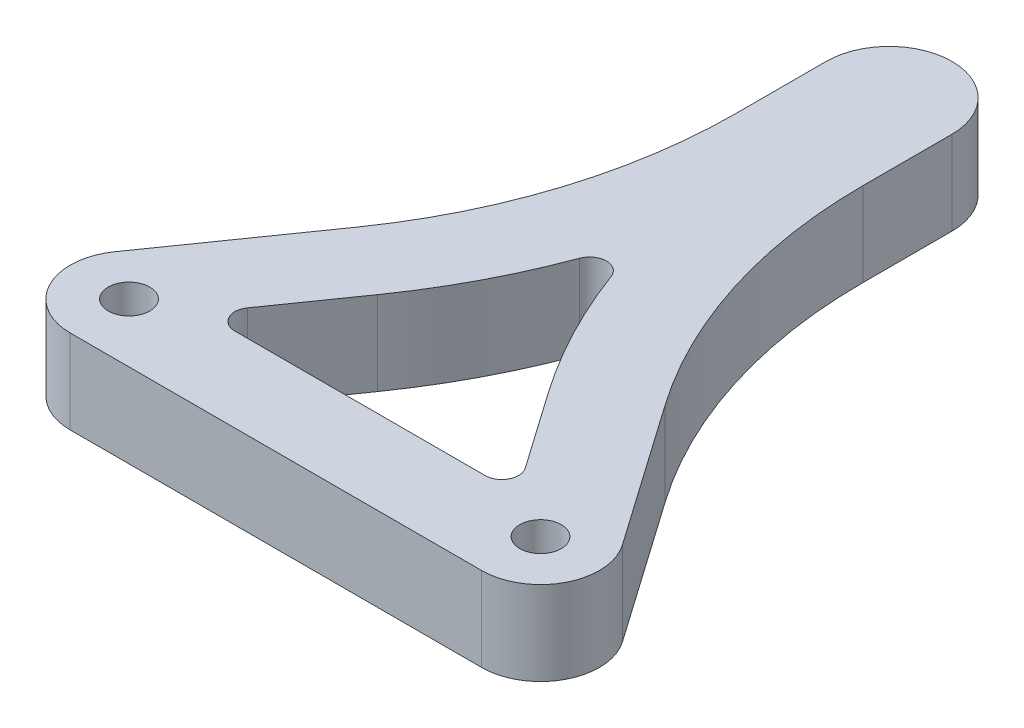
ISO-10303-21;
HEADER;
FILE_DESCRIPTION(('STEP AP214'),'2;1');
FILE_NAME('part.step','',(''),(''),'','','');
FILE_SCHEMA(('AUTOMOTIVE_DESIGN { 1 0 10303 214 1 1 1 1 }'));
ENDSEC;
DATA;
#1=APPLICATION_CONTEXT('core data for automotive mechanical design processes');
#2=APPLICATION_PROTOCOL_DEFINITION('international standard','automotive_design',2000,#1);
#3=PRODUCT_CONTEXT('',#1,'mechanical');
#4=PRODUCT('Part','Part','',(#3));
#5=PRODUCT_RELATED_PRODUCT_CATEGORY('part','',(#4));
#6=PRODUCT_DEFINITION_FORMATION('','',#4);
#7=PRODUCT_DEFINITION_CONTEXT('part definition',#1,'design');
#8=PRODUCT_DEFINITION('design','',#6,#7);
#9=PRODUCT_DEFINITION_SHAPE('','',#8);
#10=(LENGTH_UNIT() NAMED_UNIT(*) SI_UNIT(.MILLI.,.METRE.));
#11=(NAMED_UNIT(*) PLANE_ANGLE_UNIT() SI_UNIT($,.RADIAN.));
#12=(NAMED_UNIT(*) SI_UNIT($,.STERADIAN.) SOLID_ANGLE_UNIT());
#13=UNCERTAINTY_MEASURE_WITH_UNIT(LENGTH_MEASURE(1.E-05),#10,'distance_accuracy_value','');
#14=(GEOMETRIC_REPRESENTATION_CONTEXT(3) GLOBAL_UNCERTAINTY_ASSIGNED_CONTEXT((#13)) GLOBAL_UNIT_ASSIGNED_CONTEXT((#10,
#11,#12)) REPRESENTATION_CONTEXT('',''));
#15=CARTESIAN_POINT('',(0.,0.,0.));
#16=DIRECTION('',(0.,0.,1.));
#17=DIRECTION('',(1.,0.,0.));
#18=AXIS2_PLACEMENT_3D('',#15,#16,#17);
#19=CARTESIAN_POINT('',(0.,10.,-66.));
#20=DIRECTION('',(0.,1.,0.));
#21=DIRECTION('',(0.,0.,1.));
#22=AXIS2_PLACEMENT_3D('',#19,#20,#21);
#23=PLANE('',#22);
#24=CARTESIAN_POINT('',(-24.5,10.,0.));
#25=DIRECTION('',(0.,1.,0.));
#26=DIRECTION('',(0.,0.,1.));
#27=AXIS2_PLACEMENT_3D('',#24,#25,#26);
#28=CIRCLE('',#27,2.475);
#29=CARTESIAN_POINT('',(-24.5,10.,2.475));
#30=VERTEX_POINT('',#29);
#31=EDGE_CURVE('E207',#30,#30,#28,.T.);
#32=ORIENTED_EDGE('',*,*,#31,.F.);
#33=EDGE_LOOP('',(#32));
#34=FACE_BOUND('',#33,.T.);
#35=CARTESIAN_POINT('',(0.,10.,-66.));
#36=DIRECTION('',(0.,1.,0.));
#37=DIRECTION('',(0.,0.,1.));
#38=AXIS2_PLACEMENT_3D('',#35,#36,#37);
#39=CIRCLE('',#38,7.5);
#40=CARTESIAN_POINT('',(7.5,10.,-66.));
#41=VERTEX_POINT('',#40);
#42=CARTESIAN_POINT('',(-7.5,10.,-66.));
#43=VERTEX_POINT('',#42);
#44=EDGE_CURVE('E213',#41,#43,#39,.T.);
#45=ORIENTED_EDGE('',*,*,#44,.T.);
#46=DIRECTION('',(0.,0.,1.));
#47=VECTOR('',#46,1.);
#48=CARTESIAN_POINT('',(-7.5,10.,-66.));
#49=LINE('',#48,#47);
#50=CARTESIAN_POINT('',(-7.50000000000001,10.,-55.4005710167026));
#51=VERTEX_POINT('',#50);
#52=EDGE_CURVE('E216',#43,#51,#49,.T.);
#53=ORIENTED_EDGE('',*,*,#52,.T.);
#54=CARTESIAN_POINT('',(-67.5,10.,-55.4005710167026));
#55=DIRECTION('',(0.,-1.,0.));
#56=DIRECTION('',(0.,0.,1.));
#57=AXIS2_PLACEMENT_3D('',#54,#55,#56);
#58=CIRCLE('',#57,60.);
#59=CARTESIAN_POINT('',(-18.3508773426605,10.,-20.9859848356397));
#60=VERTEX_POINT('',#59);
#61=EDGE_CURVE('E219',#51,#60,#58,.T.);
#62=ORIENTED_EDGE('',*,*,#61,.T.);
#63=DIRECTION('',(-0.573576436351047,0.,0.819152044288991));
#64=VECTOR('',#63,1.);
#65=CARTESIAN_POINT('',(-18.3508773426606,10.,-20.9859848356397));
#66=LINE('',#65,#64);
#67=CARTESIAN_POINT('',(-30.2340643100229,10.,-4.01503505445733));
#68=VERTEX_POINT('',#67);
#69=EDGE_CURVE('E221',#60,#68,#66,.T.);
#70=ORIENTED_EDGE('',*,*,#69,.T.);
#71=CARTESIAN_POINT('',(-24.5,10.,0.));
#72=DIRECTION('',(0.,1.,0.));
#73=DIRECTION('',(0.,0.,1.));
#74=AXIS2_PLACEMENT_3D('',#71,#72,#73);
#75=CIRCLE('',#74,7.);
#76=CARTESIAN_POINT('',(-24.5,10.,7.));
#77=VERTEX_POINT('',#76);
#78=EDGE_CURVE('E223',#68,#77,#75,.T.);
#79=ORIENTED_EDGE('',*,*,#78,.T.);
#80=DIRECTION('',(1.,0.,0.));
#81=VECTOR('',#80,1.);
#82=CARTESIAN_POINT('',(-24.5,10.,7.));
#83=LINE('',#82,#81);
#84=CARTESIAN_POINT('',(24.5,10.,7.));
#85=VERTEX_POINT('',#84);
#86=EDGE_CURVE('E225',#77,#85,#83,.T.);
#87=ORIENTED_EDGE('',*,*,#86,.T.);
#88=CARTESIAN_POINT('',(24.5,10.,0.));
#89=DIRECTION('',(0.,1.,0.));
#90=DIRECTION('',(0.,0.,1.));
#91=AXIS2_PLACEMENT_3D('',#88,#89,#90);
#92=CIRCLE('',#91,7.);
#93=CARTESIAN_POINT('',(30.2340643100229,10.,-4.01503505445733));
#94=VERTEX_POINT('',#93);
#95=EDGE_CURVE('E227',#85,#94,#92,.T.);
#96=ORIENTED_EDGE('',*,*,#95,.T.);
#97=DIRECTION('',(-0.573576436351047,0.,-0.819152044288991));
#98=VECTOR('',#97,1.);
#99=CARTESIAN_POINT('',(18.3508773426606,10.,-20.9859848356397));
#100=LINE('',#99,#98);
#101=CARTESIAN_POINT('',(18.3508773426606,10.,-20.9859848356397));
#102=VERTEX_POINT('',#101);
#103=EDGE_CURVE('E229',#94,#102,#100,.T.);
#104=ORIENTED_EDGE('',*,*,#103,.T.);
#105=CARTESIAN_POINT('',(67.5,10.,-55.4005710167026));
#106=DIRECTION('',(0.,-1.,0.));
#107=DIRECTION('',(0.,0.,-1.));
#108=AXIS2_PLACEMENT_3D('',#105,#106,#107);
#109=CIRCLE('',#108,60.);
#110=CARTESIAN_POINT('',(7.50000000000001,10.,-55.4005710167025));
#111=VERTEX_POINT('',#110);
#112=EDGE_CURVE('E231',#102,#111,#109,.T.);
#113=ORIENTED_EDGE('',*,*,#112,.T.);
#114=DIRECTION('',(0.,0.,-1.));
#115=VECTOR('',#114,1.);
#116=CARTESIAN_POINT('',(7.5,10.,-66.));
#117=LINE('',#116,#115);
#118=EDGE_CURVE('E233',#111,#41,#117,.T.);
#119=ORIENTED_EDGE('',*,*,#118,.T.);
#120=EDGE_LOOP('',(#45,#53,#62,#70,#79,#87,#96,#104,#113,#119));
#121=FACE_BOUND('',#120,.T.);
#122=CARTESIAN_POINT('',(24.5,10.,0.));
#123=DIRECTION('',(0.,1.,0.));
#124=DIRECTION('',(0.,0.,1.));
#125=AXIS2_PLACEMENT_3D('',#122,#123,#124);
#126=CIRCLE('',#125,2.475);
#127=CARTESIAN_POINT('',(24.5,10.,2.475));
#128=VERTEX_POINT('',#127);
#129=EDGE_CURVE('E201',#128,#128,#126,.T.);
#130=ORIENTED_EDGE('',*,*,#129,.F.);
#131=EDGE_LOOP('',(#130));
#132=FACE_BOUND('',#131,.T.);
#133=DIRECTION('',(-0.573576436351047,0.,0.819152044288991));
#134=VECTOR('',#133,1.);
#135=CARTESIAN_POINT('',(-10.1593568997706,10.,-15.2502204721293));
#136=LINE('',#135,#134);
#137=CARTESIAN_POINT('',(-10.1593568997706,10.,-15.2502204721293));
#138=VERTEX_POINT('',#137);
#139=CARTESIAN_POINT('',(-16.5333934537221,10.,-6.1471528727021));
#140=VERTEX_POINT('',#139);
#141=EDGE_CURVE('E168',#138,#140,#136,.T.);
#142=ORIENTED_EDGE('',*,*,#141,.F.);
#143=CARTESIAN_POINT('',(-67.5,10.,-55.4005710167026));
#144=DIRECTION('',(0.,-1.,0.));
#145=DIRECTION('',(0.,0.,1.));
#146=AXIS2_PLACEMENT_3D('',#143,#144,#145);
#147=CIRCLE('',#146,70.);
#148=CARTESIAN_POINT('',(-1.875,10.,-31.0416019293212));
#149=VERTEX_POINT('',#148);
#150=EDGE_CURVE('E160',#149,#138,#147,.T.);
#151=ORIENTED_EDGE('',*,*,#150,.F.);
#152=CARTESIAN_POINT('',(0.,10.,-30.3456313839675));
#153=DIRECTION('',(0.,1.,0.));
#154=DIRECTION('',(0.,0.,1.));
#155=AXIS2_PLACEMENT_3D('',#152,#153,#154);
#156=CIRCLE('',#155,2.);
#157=CARTESIAN_POINT('',(1.875,10.,-31.0416019293212));
#158=VERTEX_POINT('',#157);
#159=EDGE_CURVE('E299',#149,#158,#156,.F.);
#160=ORIENTED_EDGE('',*,*,#159,.T.);
#161=CARTESIAN_POINT('',(67.5,10.,-55.4005710167026));
#162=DIRECTION('',(0.,-1.,0.));
#163=DIRECTION('',(0.,0.,-1.));
#164=AXIS2_PLACEMENT_3D('',#161,#162,#163);
#165=CIRCLE('',#164,70.);
#166=CARTESIAN_POINT('',(10.1593568997706,10.,-15.2502204721293));
#167=VERTEX_POINT('',#166);
#168=EDGE_CURVE('E186',#167,#158,#165,.T.);
#169=ORIENTED_EDGE('',*,*,#168,.F.);
#170=DIRECTION('',(-0.573576436351047,0.,-0.819152044288991));
#171=VECTOR('',#170,1.);
#172=CARTESIAN_POINT('',(10.1593568997706,10.,-15.2502204721293));
#173=LINE('',#172,#171);
#174=CARTESIAN_POINT('',(16.5333934537221,10.,-6.14715287270209));
#175=VERTEX_POINT('',#174);
#176=EDGE_CURVE('E182',#175,#167,#173,.T.);
#177=ORIENTED_EDGE('',*,*,#176,.F.);
#178=CARTESIAN_POINT('',(14.8950893651441,10.,-5.));
#179=DIRECTION('',(0.,1.,0.));
#180=DIRECTION('',(0.,0.,1.));
#181=AXIS2_PLACEMENT_3D('',#178,#179,#180);
#182=CIRCLE('',#181,2.);
#183=CARTESIAN_POINT('',(14.8950893651441,10.,-3.));
#184=VERTEX_POINT('',#183);
#185=EDGE_CURVE('E303',#175,#184,#182,.F.);
#186=ORIENTED_EDGE('',*,*,#185,.T.);
#187=DIRECTION('',(1.,0.,0.));
#188=VECTOR('',#187,1.);
#189=CARTESIAN_POINT('',(-18.7370536190865,10.,-3.));
#190=LINE('',#189,#188);
#191=CARTESIAN_POINT('',(-14.8950893651442,10.,-3.));
#192=VERTEX_POINT('',#191);
#193=EDGE_CURVE('E179',#192,#184,#190,.T.);
#194=ORIENTED_EDGE('',*,*,#193,.F.);
#195=CARTESIAN_POINT('',(-14.8950893651442,10.,-5.));
#196=DIRECTION('',(0.,1.,0.));
#197=DIRECTION('',(0.,0.,1.));
#198=AXIS2_PLACEMENT_3D('',#195,#196,#197);
#199=CIRCLE('',#198,2.);
#200=EDGE_CURVE('E11',#192,#140,#199,.F.);
#201=ORIENTED_EDGE('',*,*,#200,.T.);
#202=EDGE_LOOP('',(#142,#151,#160,#169,#177,#186,#194,#201));
#203=FACE_BOUND('',#202,.T.);
#204=ADVANCED_FACE('F35',(#34,#121,#132,#203),#23,.T.);
#205=CARTESIAN_POINT('',(0.,0.,-66.));
#206=DIRECTION('',(0.,1.,0.));
#207=DIRECTION('',(0.,0.,1.));
#208=AXIS2_PLACEMENT_3D('',#205,#206,#207);
#209=PLANE('',#208);
#210=CARTESIAN_POINT('',(24.5,0.,0.));
#211=DIRECTION('',(0.,1.,0.));
#212=DIRECTION('',(0.,0.,1.));
#213=AXIS2_PLACEMENT_3D('',#210,#211,#212);
#214=CIRCLE('',#213,2.475);
#215=CARTESIAN_POINT('',(24.5,0.,2.475));
#216=VERTEX_POINT('',#215);
#217=EDGE_CURVE('E176',#216,#216,#214,.T.);
#218=ORIENTED_EDGE('',*,*,#217,.T.);
#219=EDGE_LOOP('',(#218));
#220=FACE_BOUND('',#219,.T.);
#221=CARTESIAN_POINT('',(-24.5,0.,0.));
#222=DIRECTION('',(0.,1.,0.));
#223=DIRECTION('',(0.,0.,1.));
#224=AXIS2_PLACEMENT_3D('',#221,#222,#223);
#225=CIRCLE('',#224,2.475);
#226=CARTESIAN_POINT('',(-24.5,0.,2.475));
#227=VERTEX_POINT('',#226);
#228=EDGE_CURVE('E204',#227,#227,#225,.T.);
#229=ORIENTED_EDGE('',*,*,#228,.T.);
#230=EDGE_LOOP('',(#229));
#231=FACE_BOUND('',#230,.T.);
#232=CARTESIAN_POINT('',(0.,0.,-66.));
#233=DIRECTION('',(0.,1.,0.));
#234=DIRECTION('',(0.,0.,1.));
#235=AXIS2_PLACEMENT_3D('',#232,#233,#234);
#236=CIRCLE('',#235,7.5);
#237=CARTESIAN_POINT('',(7.5,0.,-66.));
#238=VERTEX_POINT('',#237);
#239=CARTESIAN_POINT('',(-7.5,0.,-66.));
#240=VERTEX_POINT('',#239);
#241=EDGE_CURVE('E210',#238,#240,#236,.T.);
#242=ORIENTED_EDGE('',*,*,#241,.F.);
#243=DIRECTION('',(0.,0.,-1.));
#244=VECTOR('',#243,1.);
#245=CARTESIAN_POINT('',(7.5,0.,-66.));
#246=LINE('',#245,#244);
#247=CARTESIAN_POINT('',(7.50000000000001,0.,-55.4005710167025));
#248=VERTEX_POINT('',#247);
#249=EDGE_CURVE('E217',#248,#238,#246,.T.);
#250=ORIENTED_EDGE('',*,*,#249,.F.);
#251=CARTESIAN_POINT('',(67.5,0.,-55.4005710167026));
#252=DIRECTION('',(0.,-1.,0.));
#253=DIRECTION('',(0.,0.,-1.));
#254=AXIS2_PLACEMENT_3D('',#251,#252,#253);
#255=CIRCLE('',#254,60.);
#256=CARTESIAN_POINT('',(18.3508773426606,0.,-20.9859848356397));
#257=VERTEX_POINT('',#256);
#258=EDGE_CURVE('E252',#257,#248,#255,.T.);
#259=ORIENTED_EDGE('',*,*,#258,.F.);
#260=DIRECTION('',(-0.573576436351047,0.,-0.819152044288991));
#261=VECTOR('',#260,1.);
#262=CARTESIAN_POINT('',(18.3508773426606,0.,-20.9859848356397));
#263=LINE('',#262,#261);
#264=CARTESIAN_POINT('',(30.2340643100229,0.,-4.01503505445733));
#265=VERTEX_POINT('',#264);
#266=EDGE_CURVE('E250',#265,#257,#263,.T.);
#267=ORIENTED_EDGE('',*,*,#266,.F.);
#268=CARTESIAN_POINT('',(24.5,0.,0.));
#269=DIRECTION('',(0.,1.,0.));
#270=DIRECTION('',(0.,0.,1.));
#271=AXIS2_PLACEMENT_3D('',#268,#269,#270);
#272=CIRCLE('',#271,7.);
#273=CARTESIAN_POINT('',(24.5,0.,7.));
#274=VERTEX_POINT('',#273);
#275=EDGE_CURVE('E248',#274,#265,#272,.T.);
#276=ORIENTED_EDGE('',*,*,#275,.F.);
#277=DIRECTION('',(1.,0.,0.));
#278=VECTOR('',#277,1.);
#279=CARTESIAN_POINT('',(-24.5,0.,7.));
#280=LINE('',#279,#278);
#281=CARTESIAN_POINT('',(-24.5,0.,7.));
#282=VERTEX_POINT('',#281);
#283=EDGE_CURVE('E246',#282,#274,#280,.T.);
#284=ORIENTED_EDGE('',*,*,#283,.F.);
#285=CARTESIAN_POINT('',(-24.5,0.,0.));
#286=DIRECTION('',(0.,1.,0.));
#287=DIRECTION('',(0.,0.,1.));
#288=AXIS2_PLACEMENT_3D('',#285,#286,#287);
#289=CIRCLE('',#288,7.);
#290=CARTESIAN_POINT('',(-30.2340643100229,0.,-4.01503505445733));
#291=VERTEX_POINT('',#290);
#292=EDGE_CURVE('E244',#291,#282,#289,.T.);
#293=ORIENTED_EDGE('',*,*,#292,.F.);
#294=DIRECTION('',(-0.573576436351047,0.,0.819152044288991));
#295=VECTOR('',#294,1.);
#296=CARTESIAN_POINT('',(-18.3508773426606,0.,-20.9859848356397));
#297=LINE('',#296,#295);
#298=CARTESIAN_POINT('',(-18.3508773426605,0.,-20.9859848356397));
#299=VERTEX_POINT('',#298);
#300=EDGE_CURVE('E242',#299,#291,#297,.T.);
#301=ORIENTED_EDGE('',*,*,#300,.F.);
#302=CARTESIAN_POINT('',(-67.5,0.,-55.4005710167026));
#303=DIRECTION('',(0.,-1.,0.));
#304=DIRECTION('',(0.,0.,1.));
#305=AXIS2_PLACEMENT_3D('',#302,#303,#304);
#306=CIRCLE('',#305,60.);
#307=CARTESIAN_POINT('',(-7.50000000000001,0.,-55.4005710167026));
#308=VERTEX_POINT('',#307);
#309=EDGE_CURVE('E240',#308,#299,#306,.T.);
#310=ORIENTED_EDGE('',*,*,#309,.F.);
#311=DIRECTION('',(0.,0.,1.));
#312=VECTOR('',#311,1.);
#313=CARTESIAN_POINT('',(-7.5,0.,-66.));
#314=LINE('',#313,#312);
#315=EDGE_CURVE('E238',#240,#308,#314,.T.);
#316=ORIENTED_EDGE('',*,*,#315,.F.);
#317=EDGE_LOOP('',(#242,#250,#259,#267,#276,#284,#293,#301,#310,#316));
#318=FACE_BOUND('',#317,.T.);
#319=CARTESIAN_POINT('',(67.5,0.,-55.4005710167026));
#320=DIRECTION('',(0.,-1.,0.));
#321=DIRECTION('',(0.,0.,-1.));
#322=AXIS2_PLACEMENT_3D('',#319,#320,#321);
#323=CIRCLE('',#322,70.);
#324=CARTESIAN_POINT('',(10.1593568997706,0.,-15.2502204721293));
#325=VERTEX_POINT('',#324);
#326=CARTESIAN_POINT('',(1.875,0.,-31.0416019293212));
#327=VERTEX_POINT('',#326);
#328=EDGE_CURVE('E169',#325,#327,#323,.T.);
#329=ORIENTED_EDGE('',*,*,#328,.T.);
#330=CARTESIAN_POINT('',(0.,0.,-30.3456313839675));
#331=DIRECTION('',(0.,1.,0.));
#332=DIRECTION('',(0.,0.,1.));
#333=AXIS2_PLACEMENT_3D('',#330,#331,#332);
#334=CIRCLE('',#333,2.);
#335=CARTESIAN_POINT('',(-1.875,0.,-31.0416019293212));
#336=VERTEX_POINT('',#335);
#337=EDGE_CURVE('E297',#327,#336,#334,.T.);
#338=ORIENTED_EDGE('',*,*,#337,.T.);
#339=CARTESIAN_POINT('',(-67.5,0.,-55.4005710167026));
#340=DIRECTION('',(0.,-1.,0.));
#341=DIRECTION('',(0.,0.,1.));
#342=AXIS2_PLACEMENT_3D('',#339,#340,#341);
#343=CIRCLE('',#342,70.);
#344=CARTESIAN_POINT('',(-10.1593568997706,0.,-15.2502204721293));
#345=VERTEX_POINT('',#344);
#346=EDGE_CURVE('E189',#336,#345,#343,.T.);
#347=ORIENTED_EDGE('',*,*,#346,.T.);
#348=DIRECTION('',(-0.573576436351047,0.,0.819152044288991));
#349=VECTOR('',#348,1.);
#350=CARTESIAN_POINT('',(-10.1593568997706,0.,-15.2502204721293));
#351=LINE('',#350,#349);
#352=CARTESIAN_POINT('',(-16.5333934537221,0.,-6.1471528727021));
#353=VERTEX_POINT('',#352);
#354=EDGE_CURVE('E175',#345,#353,#351,.T.);
#355=ORIENTED_EDGE('',*,*,#354,.T.);
#356=CARTESIAN_POINT('',(-14.8950893651442,0.,-5.));
#357=DIRECTION('',(0.,1.,0.));
#358=DIRECTION('',(0.,0.,1.));
#359=AXIS2_PLACEMENT_3D('',#356,#357,#358);
#360=CIRCLE('',#359,2.);
#361=CARTESIAN_POINT('',(-14.8950893651442,0.,-3.));
#362=VERTEX_POINT('',#361);
#363=EDGE_CURVE('E43',#353,#362,#360,.T.);
#364=ORIENTED_EDGE('',*,*,#363,.T.);
#365=DIRECTION('',(1.,0.,0.));
#366=VECTOR('',#365,1.);
#367=CARTESIAN_POINT('',(-18.7370536190865,0.,-3.));
#368=LINE('',#367,#366);
#369=CARTESIAN_POINT('',(14.8950893651441,0.,-3.));
#370=VERTEX_POINT('',#369);
#371=EDGE_CURVE('E192',#362,#370,#368,.T.);
#372=ORIENTED_EDGE('',*,*,#371,.T.);
#373=CARTESIAN_POINT('',(14.8950893651441,0.,-5.));
#374=DIRECTION('',(0.,1.,0.));
#375=DIRECTION('',(0.,0.,1.));
#376=AXIS2_PLACEMENT_3D('',#373,#374,#375);
#377=CIRCLE('',#376,2.);
#378=CARTESIAN_POINT('',(16.5333934537221,0.,-6.14715287270209));
#379=VERTEX_POINT('',#378);
#380=EDGE_CURVE('E301',#370,#379,#377,.T.);
#381=ORIENTED_EDGE('',*,*,#380,.T.);
#382=DIRECTION('',(-0.573576436351047,0.,-0.819152044288991));
#383=VECTOR('',#382,1.);
#384=CARTESIAN_POINT('',(10.1593568997706,0.,-15.2502204721293));
#385=LINE('',#384,#383);
#386=EDGE_CURVE('E195',#379,#325,#385,.T.);
#387=ORIENTED_EDGE('',*,*,#386,.T.);
#388=EDGE_LOOP('',(#329,#338,#347,#355,#364,#372,#381,#387));
#389=FACE_BOUND('',#388,.T.);
#390=ADVANCED_FACE('F306',(#220,#231,#318,#389),#209,.F.);
#391=CARTESIAN_POINT('',(0.,10.,-66.));
#392=DIRECTION('',(0.,-1.,0.));
#393=DIRECTION('',(0.,0.,-1.));
#394=AXIS2_PLACEMENT_3D('',#391,#392,#393);
#395=CYLINDRICAL_SURFACE('',#394,7.5);
#396=ORIENTED_EDGE('',*,*,#241,.T.);
#397=DIRECTION('',(0.,-1.,0.));
#398=VECTOR('',#397,1.);
#399=CARTESIAN_POINT('',(-7.5,10.,-66.));
#400=LINE('',#399,#398);
#401=EDGE_CURVE('E281',#43,#240,#400,.T.);
#402=ORIENTED_EDGE('',*,*,#401,.F.);
#403=ORIENTED_EDGE('',*,*,#44,.F.);
#404=DIRECTION('',(0.,-1.,0.));
#405=VECTOR('',#404,1.);
#406=CARTESIAN_POINT('',(7.5,10.,-66.));
#407=LINE('',#406,#405);
#408=EDGE_CURVE('E235',#41,#238,#407,.T.);
#409=ORIENTED_EDGE('',*,*,#408,.T.);
#410=EDGE_LOOP('',(#396,#402,#403,#409));
#411=FACE_BOUND('',#410,.T.);
#412=ADVANCED_FACE('F323',(#411),#395,.T.);
#413=CARTESIAN_POINT('',(-7.5,10.,-66.));
#414=DIRECTION('',(1.,0.,0.));
#415=DIRECTION('',(0.,0.,-1.));
#416=AXIS2_PLACEMENT_3D('',#413,#414,#415);
#417=PLANE('',#416);
#418=ORIENTED_EDGE('',*,*,#315,.T.);
#419=DIRECTION('',(0.,-1.,0.));
#420=VECTOR('',#419,1.);
#421=CARTESIAN_POINT('',(-7.50000000000001,10.,-55.4005710167026));
#422=LINE('',#421,#420);
#423=EDGE_CURVE('E278',#51,#308,#422,.T.);
#424=ORIENTED_EDGE('',*,*,#423,.F.);
#425=ORIENTED_EDGE('',*,*,#52,.F.);
#426=ORIENTED_EDGE('',*,*,#401,.T.);
#427=EDGE_LOOP('',(#418,#424,#425,#426));
#428=FACE_BOUND('',#427,.T.);
#429=ADVANCED_FACE('F363',(#428),#417,.F.);
#430=CARTESIAN_POINT('',(-67.5,10.,-55.4005710167026));
#431=DIRECTION('',(0.,-1.,0.));
#432=DIRECTION('',(0.,0.,-1.));
#433=AXIS2_PLACEMENT_3D('',#430,#431,#432);
#434=CYLINDRICAL_SURFACE('',#433,60.);
#435=ORIENTED_EDGE('',*,*,#309,.T.);
#436=DIRECTION('',(0.,-1.,0.));
#437=VECTOR('',#436,1.);
#438=CARTESIAN_POINT('',(-18.3508773426605,10.,-20.9859848356397));
#439=LINE('',#438,#437);
#440=EDGE_CURVE('E275',#60,#299,#439,.T.);
#441=ORIENTED_EDGE('',*,*,#440,.F.);
#442=ORIENTED_EDGE('',*,*,#61,.F.);
#443=ORIENTED_EDGE('',*,*,#423,.T.);
#444=EDGE_LOOP('',(#435,#441,#442,#443));
#445=FACE_BOUND('',#444,.T.);
#446=ADVANCED_FACE('F359',(#445),#434,.F.);
#447=CARTESIAN_POINT('',(-18.3508773426606,10.,-20.9859848356397));
#448=DIRECTION('',(0.819152044288991,0.,0.573576436351047));
#449=DIRECTION('',(0.573576436351047,0.,-0.819152044288991));
#450=AXIS2_PLACEMENT_3D('',#447,#448,#449);
#451=PLANE('',#450);
#452=ORIENTED_EDGE('',*,*,#300,.T.);
#453=DIRECTION('',(0.,-1.,0.));
#454=VECTOR('',#453,1.);
#455=CARTESIAN_POINT('',(-30.2340643100229,10.,-4.01503505445733));
#456=LINE('',#455,#454);
#457=EDGE_CURVE('E272',#68,#291,#456,.T.);
#458=ORIENTED_EDGE('',*,*,#457,.F.);
#459=ORIENTED_EDGE('',*,*,#69,.F.);
#460=ORIENTED_EDGE('',*,*,#440,.T.);
#461=EDGE_LOOP('',(#452,#458,#459,#460));
#462=FACE_BOUND('',#461,.T.);
#463=ADVANCED_FACE('F355',(#462),#451,.F.);
#464=CARTESIAN_POINT('',(-24.5,10.,0.));
#465=DIRECTION('',(0.,-1.,0.));
#466=DIRECTION('',(0.,0.,-1.));
#467=AXIS2_PLACEMENT_3D('',#464,#465,#466);
#468=CYLINDRICAL_SURFACE('',#467,7.);
#469=ORIENTED_EDGE('',*,*,#292,.T.);
#470=DIRECTION('',(0.,-1.,0.));
#471=VECTOR('',#470,1.);
#472=CARTESIAN_POINT('',(-24.5,10.,7.));
#473=LINE('',#472,#471);
#474=EDGE_CURVE('E269',#77,#282,#473,.T.);
#475=ORIENTED_EDGE('',*,*,#474,.F.);
#476=ORIENTED_EDGE('',*,*,#78,.F.);
#477=ORIENTED_EDGE('',*,*,#457,.T.);
#478=EDGE_LOOP('',(#469,#475,#476,#477));
#479=FACE_BOUND('',#478,.T.);
#480=ADVANCED_FACE('F351',(#479),#468,.T.);
#481=CARTESIAN_POINT('',(-24.5,10.,7.));
#482=DIRECTION('',(0.,0.,-1.));
#483=DIRECTION('',(-1.,0.,0.));
#484=AXIS2_PLACEMENT_3D('',#481,#482,#483);
#485=PLANE('',#484);
#486=ORIENTED_EDGE('',*,*,#283,.T.);
#487=DIRECTION('',(0.,-1.,0.));
#488=VECTOR('',#487,1.);
#489=CARTESIAN_POINT('',(24.5,10.,7.));
#490=LINE('',#489,#488);
#491=EDGE_CURVE('E266',#85,#274,#490,.T.);
#492=ORIENTED_EDGE('',*,*,#491,.F.);
#493=ORIENTED_EDGE('',*,*,#86,.F.);
#494=ORIENTED_EDGE('',*,*,#474,.T.);
#495=EDGE_LOOP('',(#486,#492,#493,#494));
#496=FACE_BOUND('',#495,.T.);
#497=ADVANCED_FACE('F347',(#496),#485,.F.);
#498=CARTESIAN_POINT('',(24.5,10.,0.));
#499=DIRECTION('',(0.,-1.,0.));
#500=DIRECTION('',(0.,0.,-1.));
#501=AXIS2_PLACEMENT_3D('',#498,#499,#500);
#502=CYLINDRICAL_SURFACE('',#501,7.);
#503=ORIENTED_EDGE('',*,*,#275,.T.);
#504=DIRECTION('',(0.,-1.,0.));
#505=VECTOR('',#504,1.);
#506=CARTESIAN_POINT('',(30.2340643100229,10.,-4.01503505445733));
#507=LINE('',#506,#505);
#508=EDGE_CURVE('E263',#94,#265,#507,.T.);
#509=ORIENTED_EDGE('',*,*,#508,.F.);
#510=ORIENTED_EDGE('',*,*,#95,.F.);
#511=ORIENTED_EDGE('',*,*,#491,.T.);
#512=EDGE_LOOP('',(#503,#509,#510,#511));
#513=FACE_BOUND('',#512,.T.);
#514=ADVANCED_FACE('F343',(#513),#502,.T.);
#515=CARTESIAN_POINT('',(18.3508773426606,10.,-20.9859848356397));
#516=DIRECTION('',(-0.819152044288991,0.,0.573576436351047));
#517=DIRECTION('',(0.573576436351047,0.,0.819152044288991));
#518=AXIS2_PLACEMENT_3D('',#515,#516,#517);
#519=PLANE('',#518);
#520=ORIENTED_EDGE('',*,*,#266,.T.);
#521=DIRECTION('',(0.,-1.,0.));
#522=VECTOR('',#521,1.);
#523=CARTESIAN_POINT('',(18.3508773426606,10.,-20.9859848356397));
#524=LINE('',#523,#522);
#525=EDGE_CURVE('E260',#102,#257,#524,.T.);
#526=ORIENTED_EDGE('',*,*,#525,.F.);
#527=ORIENTED_EDGE('',*,*,#103,.F.);
#528=ORIENTED_EDGE('',*,*,#508,.T.);
#529=EDGE_LOOP('',(#520,#526,#527,#528));
#530=FACE_BOUND('',#529,.T.);
#531=ADVANCED_FACE('F339',(#530),#519,.F.);
#532=CARTESIAN_POINT('',(67.5,10.,-55.4005710167026));
#533=DIRECTION('',(0.,-1.,0.));
#534=DIRECTION('',(0.,0.,-1.));
#535=AXIS2_PLACEMENT_3D('',#532,#533,#534);
#536=CYLINDRICAL_SURFACE('',#535,60.);
#537=ORIENTED_EDGE('',*,*,#258,.T.);
#538=DIRECTION('',(0.,-1.,0.));
#539=VECTOR('',#538,1.);
#540=CARTESIAN_POINT('',(7.50000000000001,10.,-55.4005710167025));
#541=LINE('',#540,#539);
#542=EDGE_CURVE('E257',#111,#248,#541,.T.);
#543=ORIENTED_EDGE('',*,*,#542,.F.);
#544=ORIENTED_EDGE('',*,*,#112,.F.);
#545=ORIENTED_EDGE('',*,*,#525,.T.);
#546=EDGE_LOOP('',(#537,#543,#544,#545));
#547=FACE_BOUND('',#546,.T.);
#548=ADVANCED_FACE('F335',(#547),#536,.F.);
#549=CARTESIAN_POINT('',(7.5,10.,-66.));
#550=DIRECTION('',(-1.,0.,0.));
#551=DIRECTION('',(0.,0.,1.));
#552=AXIS2_PLACEMENT_3D('',#549,#550,#551);
#553=PLANE('',#552);
#554=ORIENTED_EDGE('',*,*,#249,.T.);
#555=ORIENTED_EDGE('',*,*,#408,.F.);
#556=ORIENTED_EDGE('',*,*,#118,.F.);
#557=ORIENTED_EDGE('',*,*,#542,.T.);
#558=EDGE_LOOP('',(#554,#555,#556,#557));
#559=FACE_BOUND('',#558,.T.);
#560=ADVANCED_FACE('F332',(#559),#553,.F.);
#561=CARTESIAN_POINT('',(-24.5,10.,0.));
#562=DIRECTION('',(0.,-1.,0.));
#563=DIRECTION('',(0.,0.,-1.));
#564=AXIS2_PLACEMENT_3D('',#561,#562,#563);
#565=CYLINDRICAL_SURFACE('',#564,2.475);
#566=ORIENTED_EDGE('',*,*,#31,.T.);
#567=EDGE_LOOP('',(#566));
#568=FACE_BOUND('',#567,.T.);
#569=ORIENTED_EDGE('',*,*,#228,.F.);
#570=EDGE_LOOP('',(#569));
#571=FACE_BOUND('',#570,.T.);
#572=ADVANCED_FACE('F329',(#568,#571),#565,.F.);
#573=CARTESIAN_POINT('',(24.5,10.,0.));
#574=DIRECTION('',(0.,-1.,0.));
#575=DIRECTION('',(0.,0.,-1.));
#576=AXIS2_PLACEMENT_3D('',#573,#574,#575);
#577=CYLINDRICAL_SURFACE('',#576,2.475);
#578=ORIENTED_EDGE('',*,*,#129,.T.);
#579=EDGE_LOOP('',(#578));
#580=FACE_BOUND('',#579,.T.);
#581=ORIENTED_EDGE('',*,*,#217,.F.);
#582=EDGE_LOOP('',(#581));
#583=FACE_BOUND('',#582,.T.);
#584=ADVANCED_FACE('F399',(#580,#583),#577,.F.);
#585=CARTESIAN_POINT('',(-67.5,10.,-55.4005710167026));
#586=DIRECTION('',(0.,-1.,0.));
#587=DIRECTION('',(0.,0.,-1.));
#588=AXIS2_PLACEMENT_3D('',#585,#586,#587);
#589=CYLINDRICAL_SURFACE('',#588,70.);
#590=ORIENTED_EDGE('',*,*,#346,.F.);
#591=DIRECTION('',(0.,-1.,0.));
#592=VECTOR('',#591,1.);
#593=CARTESIAN_POINT('',(-1.875,10.,-31.0416019293212));
#594=LINE('',#593,#592);
#595=EDGE_CURVE('E166',#336,#149,#594,.F.);
#596=ORIENTED_EDGE('',*,*,#595,.T.);
#597=ORIENTED_EDGE('',*,*,#150,.T.);
#598=DIRECTION('',(0.,-1.,0.));
#599=VECTOR('',#598,1.);
#600=CARTESIAN_POINT('',(-10.1593568997706,10.,-15.2502204721293));
#601=LINE('',#600,#599);
#602=EDGE_CURVE('E164',#138,#345,#601,.T.);
#603=ORIENTED_EDGE('',*,*,#602,.T.);
#604=EDGE_LOOP('',(#590,#596,#597,#603));
#605=FACE_BOUND('',#604,.T.);
#606=ADVANCED_FACE('F163',(#605),#589,.T.);
#607=CARTESIAN_POINT('',(-10.1593568997706,10.,-15.2502204721293));
#608=DIRECTION('',(0.819152044288991,0.,0.573576436351047));
#609=DIRECTION('',(0.573576436351047,0.,-0.819152044288991));
#610=AXIS2_PLACEMENT_3D('',#607,#608,#609);
#611=PLANE('',#610);
#612=ORIENTED_EDGE('',*,*,#141,.T.);
#613=DIRECTION('',(0.,-1.,0.));
#614=VECTOR('',#613,1.);
#615=CARTESIAN_POINT('',(-16.5333934537221,0.,-6.14715287270209));
#616=LINE('',#615,#614);
#617=EDGE_CURVE('E295',#140,#353,#616,.T.);
#618=ORIENTED_EDGE('',*,*,#617,.T.);
#619=ORIENTED_EDGE('',*,*,#354,.F.);
#620=ORIENTED_EDGE('',*,*,#602,.F.);
#621=EDGE_LOOP('',(#612,#618,#619,#620));
#622=FACE_BOUND('',#621,.T.);
#623=ADVANCED_FACE('F173',(#622),#611,.T.);
#624=CARTESIAN_POINT('',(-18.7370536190865,10.,-3.));
#625=DIRECTION('',(0.,0.,-1.));
#626=DIRECTION('',(-1.,0.,0.));
#627=AXIS2_PLACEMENT_3D('',#624,#625,#626);
#628=PLANE('',#627);
#629=ORIENTED_EDGE('',*,*,#193,.T.);
#630=DIRECTION('',(0.,-1.,0.));
#631=VECTOR('',#630,1.);
#632=CARTESIAN_POINT('',(14.8950893651441,0.,-3.));
#633=LINE('',#632,#631);
#634=EDGE_CURVE('E290',#184,#370,#633,.T.);
#635=ORIENTED_EDGE('',*,*,#634,.T.);
#636=ORIENTED_EDGE('',*,*,#371,.F.);
#637=DIRECTION('',(0.,-1.,0.));
#638=VECTOR('',#637,1.);
#639=CARTESIAN_POINT('',(-14.8950893651442,10.,-3.));
#640=LINE('',#639,#638);
#641=EDGE_CURVE('E288',#362,#192,#640,.F.);
#642=ORIENTED_EDGE('',*,*,#641,.T.);
#643=EDGE_LOOP('',(#629,#635,#636,#642));
#644=FACE_BOUND('',#643,.T.);
#645=ADVANCED_FACE('F308',(#644),#628,.T.);
#646=CARTESIAN_POINT('',(10.1593568997706,10.,-15.2502204721293));
#647=DIRECTION('',(-0.819152044288991,0.,0.573576436351047));
#648=DIRECTION('',(0.573576436351047,0.,0.819152044288991));
#649=AXIS2_PLACEMENT_3D('',#646,#647,#648);
#650=PLANE('',#649);
#651=ORIENTED_EDGE('',*,*,#386,.F.);
#652=DIRECTION('',(0.,-1.,0.));
#653=VECTOR('',#652,1.);
#654=CARTESIAN_POINT('',(16.5333934537221,10.,-6.1471528727021));
#655=LINE('',#654,#653);
#656=EDGE_CURVE('E293',#379,#175,#655,.F.);
#657=ORIENTED_EDGE('',*,*,#656,.T.);
#658=ORIENTED_EDGE('',*,*,#176,.T.);
#659=DIRECTION('',(0.,-1.,0.));
#660=VECTOR('',#659,1.);
#661=CARTESIAN_POINT('',(10.1593568997706,10.,-15.2502204721293));
#662=LINE('',#661,#660);
#663=EDGE_CURVE('E177',#167,#325,#662,.T.);
#664=ORIENTED_EDGE('',*,*,#663,.T.);
#665=EDGE_LOOP('',(#651,#657,#658,#664));
#666=FACE_BOUND('',#665,.T.);
#667=ADVANCED_FACE('F377',(#666),#650,.T.);
#668=CARTESIAN_POINT('',(67.5,10.,-55.4005710167026));
#669=DIRECTION('',(0.,-1.,0.));
#670=DIRECTION('',(0.,0.,-1.));
#671=AXIS2_PLACEMENT_3D('',#668,#669,#670);
#672=CYLINDRICAL_SURFACE('',#671,70.);
#673=ORIENTED_EDGE('',*,*,#168,.T.);
#674=DIRECTION('',(0.,-1.,0.));
#675=VECTOR('',#674,1.);
#676=CARTESIAN_POINT('',(1.875,10.,-31.0416019293212));
#677=LINE('',#676,#675);
#678=EDGE_CURVE('E284',#158,#327,#677,.T.);
#679=ORIENTED_EDGE('',*,*,#678,.T.);
#680=ORIENTED_EDGE('',*,*,#328,.F.);
#681=ORIENTED_EDGE('',*,*,#663,.F.);
#682=EDGE_LOOP('',(#673,#679,#680,#681));
#683=FACE_BOUND('',#682,.T.);
#684=ADVANCED_FACE('F372',(#683),#672,.T.);
#685=CARTESIAN_POINT('',(0.,10.,-30.3456313839675));
#686=DIRECTION('',(0.,1.,0.));
#687=DIRECTION('',(0.,0.,1.));
#688=AXIS2_PLACEMENT_3D('',#685,#686,#687);
#689=CYLINDRICAL_SURFACE('',#688,2.);
#690=ORIENTED_EDGE('',*,*,#159,.F.);
#691=ORIENTED_EDGE('',*,*,#595,.F.);
#692=ORIENTED_EDGE('',*,*,#337,.F.);
#693=ORIENTED_EDGE('',*,*,#678,.F.);
#694=EDGE_LOOP('',(#690,#691,#692,#693));
#695=FACE_BOUND('',#694,.T.);
#696=ADVANCED_FACE('F315',(#695),#689,.F.);
#697=CARTESIAN_POINT('',(14.8950893651441,10.,-5.));
#698=DIRECTION('',(0.,1.,0.));
#699=DIRECTION('',(0.,0.,1.));
#700=AXIS2_PLACEMENT_3D('',#697,#698,#699);
#701=CYLINDRICAL_SURFACE('',#700,2.);
#702=ORIENTED_EDGE('',*,*,#185,.F.);
#703=ORIENTED_EDGE('',*,*,#656,.F.);
#704=ORIENTED_EDGE('',*,*,#380,.F.);
#705=ORIENTED_EDGE('',*,*,#634,.F.);
#706=EDGE_LOOP('',(#702,#703,#704,#705));
#707=FACE_BOUND('',#706,.T.);
#708=ADVANCED_FACE('F311',(#707),#701,.F.);
#709=CARTESIAN_POINT('',(-14.8950893651442,10.,-5.));
#710=DIRECTION('',(0.,1.,0.));
#711=DIRECTION('',(0.,0.,1.));
#712=AXIS2_PLACEMENT_3D('',#709,#710,#711);
#713=CYLINDRICAL_SURFACE('',#712,2.);
#714=ORIENTED_EDGE('',*,*,#200,.F.);
#715=ORIENTED_EDGE('',*,*,#641,.F.);
#716=ORIENTED_EDGE('',*,*,#363,.F.);
#717=ORIENTED_EDGE('',*,*,#617,.F.);
#718=EDGE_LOOP('',(#714,#715,#716,#717));
#719=FACE_BOUND('',#718,.T.);
#720=ADVANCED_FACE('F37',(#719),#713,.F.);
#721=CLOSED_SHELL('',(#204,#390,#412,#429,#446,#463,#480,#497,#514,#531,#548,#560,#572,#584,
#606,#623,#645,#667,#684,#696,#708,#720));
#722=MANIFOLD_SOLID_BREP('B2',#721);
#723=ADVANCED_BREP_SHAPE_REPRESENTATION('',(#18,#722),#14);
#724=SHAPE_DEFINITION_REPRESENTATION(#9,#723);
ENDSEC;
END-ISO-10303-21;
